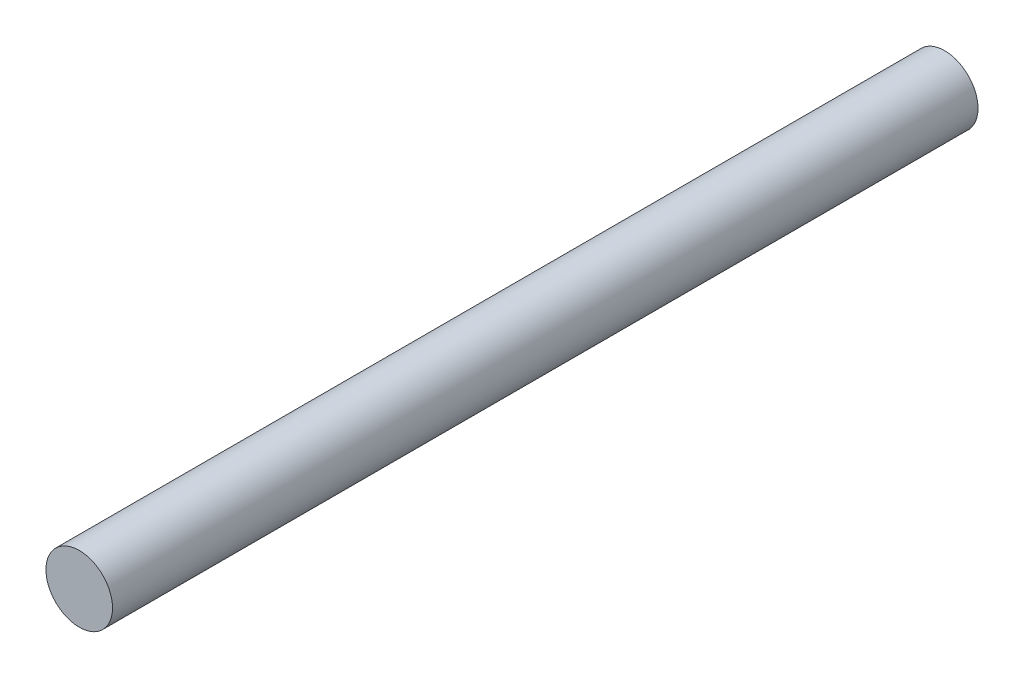
ISO-10303-21;
HEADER;
FILE_DESCRIPTION(('STEP AP214'),'2;1');
FILE_NAME('part.step','',(''),(''),'','','');
FILE_SCHEMA(('AUTOMOTIVE_DESIGN { 1 0 10303 214 1 1 1 1 }'));
ENDSEC;
DATA;
#1=APPLICATION_CONTEXT('core data for automotive mechanical design processes');
#2=APPLICATION_PROTOCOL_DEFINITION('international standard','automotive_design',2000,#1);
#3=PRODUCT_CONTEXT('',#1,'mechanical');
#4=PRODUCT('Part','Part','',(#3));
#5=PRODUCT_RELATED_PRODUCT_CATEGORY('part','',(#4));
#6=PRODUCT_DEFINITION_FORMATION('','',#4);
#7=PRODUCT_DEFINITION_CONTEXT('part definition',#1,'design');
#8=PRODUCT_DEFINITION('design','',#6,#7);
#9=PRODUCT_DEFINITION_SHAPE('','',#8);
#10=(LENGTH_UNIT() NAMED_UNIT(*) SI_UNIT(.MILLI.,.METRE.));
#11=(NAMED_UNIT(*) PLANE_ANGLE_UNIT() SI_UNIT($,.RADIAN.));
#12=(NAMED_UNIT(*) SI_UNIT($,.STERADIAN.) SOLID_ANGLE_UNIT());
#13=UNCERTAINTY_MEASURE_WITH_UNIT(LENGTH_MEASURE(1.E-05),#10,'distance_accuracy_value','');
#14=(GEOMETRIC_REPRESENTATION_CONTEXT(3) GLOBAL_UNCERTAINTY_ASSIGNED_CONTEXT((#13)) GLOBAL_UNIT_ASSIGNED_CONTEXT((#10,
#11,#12)) REPRESENTATION_CONTEXT('',''));
#15=CARTESIAN_POINT('',(0.,0.,0.));
#16=DIRECTION('',(0.,0.,1.));
#17=DIRECTION('',(1.,0.,0.));
#18=AXIS2_PLACEMENT_3D('',#15,#16,#17);
#19=CARTESIAN_POINT('',(0.,0.,130.));
#20=DIRECTION('',(0.,0.,-1.));
#21=DIRECTION('',(-1.,0.,0.));
#22=AXIS2_PLACEMENT_3D('',#19,#20,#21);
#23=CYLINDRICAL_SURFACE('',#22,10.);
#24=CARTESIAN_POINT('',(0.,0.,130.));
#25=DIRECTION('',(0.,0.,1.));
#26=DIRECTION('',(1.,0.,0.));
#27=AXIS2_PLACEMENT_3D('',#24,#25,#26);
#28=CIRCLE('',#27,10.);
#29=CARTESIAN_POINT('',(10.,0.,130.));
#30=VERTEX_POINT('',#29);
#31=EDGE_CURVE('E10',#30,#30,#28,.T.);
#32=ORIENTED_EDGE('',*,*,#31,.F.);
#33=EDGE_LOOP('',(#32));
#34=FACE_BOUND('',#33,.T.);
#35=CARTESIAN_POINT('',(0.,0.,-130.));
#36=DIRECTION('',(0.,0.,1.));
#37=DIRECTION('',(1.,0.,0.));
#38=AXIS2_PLACEMENT_3D('',#35,#36,#37);
#39=CIRCLE('',#38,10.);
#40=CARTESIAN_POINT('',(10.,0.,-130.));
#41=VERTEX_POINT('',#40);
#42=EDGE_CURVE('E34',#41,#41,#39,.T.);
#43=ORIENTED_EDGE('',*,*,#42,.T.);
#44=EDGE_LOOP('',(#43));
#45=FACE_BOUND('',#44,.T.);
#46=ADVANCED_FACE('F31',(#34,#45),#23,.T.);
#47=CARTESIAN_POINT('',(0.,0.,130.));
#48=DIRECTION('',(0.,0.,1.));
#49=DIRECTION('',(1.,0.,0.));
#50=AXIS2_PLACEMENT_3D('',#47,#48,#49);
#51=PLANE('',#50);
#52=ORIENTED_EDGE('',*,*,#31,.T.);
#53=EDGE_LOOP('',(#52));
#54=FACE_BOUND('',#53,.T.);
#55=ADVANCED_FACE('F46',(#54),#51,.T.);
#56=CARTESIAN_POINT('',(0.,0.,-130.));
#57=DIRECTION('',(0.,0.,1.));
#58=DIRECTION('',(1.,0.,0.));
#59=AXIS2_PLACEMENT_3D('',#56,#57,#58);
#60=PLANE('',#59);
#61=ORIENTED_EDGE('',*,*,#42,.F.);
#62=EDGE_LOOP('',(#61));
#63=FACE_BOUND('',#62,.T.);
#64=ADVANCED_FACE('F44',(#63),#60,.F.);
#65=CLOSED_SHELL('',(#46,#55,#64));
#66=MANIFOLD_SOLID_BREP('B2',#65);
#67=ADVANCED_BREP_SHAPE_REPRESENTATION('',(#18,#66),#14);
#68=SHAPE_DEFINITION_REPRESENTATION(#9,#67);
ENDSEC;
END-ISO-10303-21;
